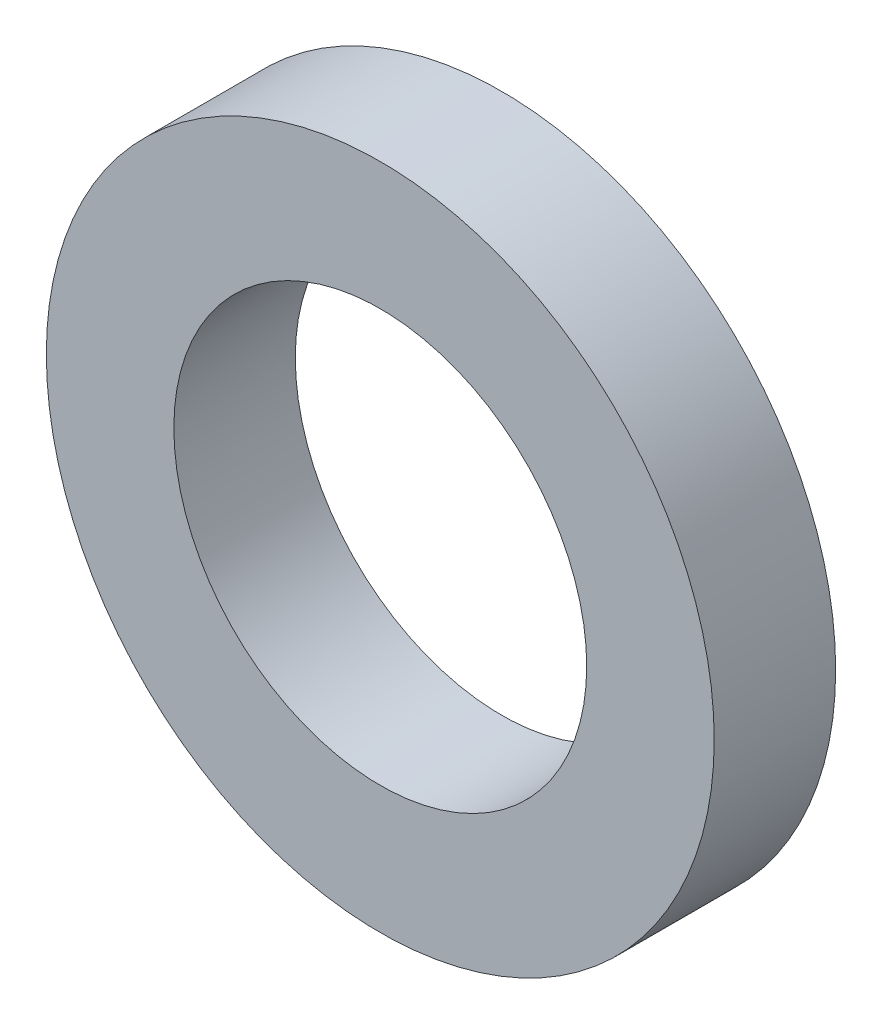
ISO-10303-21;
HEADER;
FILE_DESCRIPTION(('STEP AP214'),'2;1');
FILE_NAME('part.step','',(''),(''),'','','');
FILE_SCHEMA(('AUTOMOTIVE_DESIGN { 1 0 10303 214 1 1 1 1 }'));
ENDSEC;
DATA;
#1=APPLICATION_CONTEXT('core data for automotive mechanical design processes');
#2=APPLICATION_PROTOCOL_DEFINITION('international standard','automotive_design',2000,#1);
#3=PRODUCT_CONTEXT('',#1,'mechanical');
#4=PRODUCT('Part','Part','',(#3));
#5=PRODUCT_RELATED_PRODUCT_CATEGORY('part','',(#4));
#6=PRODUCT_DEFINITION_FORMATION('','',#4);
#7=PRODUCT_DEFINITION_CONTEXT('part definition',#1,'design');
#8=PRODUCT_DEFINITION('design','',#6,#7);
#9=PRODUCT_DEFINITION_SHAPE('','',#8);
#10=(LENGTH_UNIT() NAMED_UNIT(*) SI_UNIT(.MILLI.,.METRE.));
#11=(NAMED_UNIT(*) PLANE_ANGLE_UNIT() SI_UNIT($,.RADIAN.));
#12=(NAMED_UNIT(*) SI_UNIT($,.STERADIAN.) SOLID_ANGLE_UNIT());
#13=UNCERTAINTY_MEASURE_WITH_UNIT(LENGTH_MEASURE(1.E-05),#10,'distance_accuracy_value','');
#14=(GEOMETRIC_REPRESENTATION_CONTEXT(3) GLOBAL_UNCERTAINTY_ASSIGNED_CONTEXT((#13)) GLOBAL_UNIT_ASSIGNED_CONTEXT((#10,
#11,#12)) REPRESENTATION_CONTEXT('',''));
#15=CARTESIAN_POINT('',(0.,0.,0.));
#16=DIRECTION('',(0.,0.,1.));
#17=DIRECTION('',(1.,0.,0.));
#18=AXIS2_PLACEMENT_3D('',#15,#16,#17);
#19=CARTESIAN_POINT('',(0.,0.,1.));
#20=DIRECTION('',(0.,0.,1.));
#21=DIRECTION('',(1.,0.,0.));
#22=AXIS2_PLACEMENT_3D('',#19,#20,#21);
#23=PLANE('',#22);
#24=CARTESIAN_POINT('',(0.,0.,1.));
#25=DIRECTION('',(0.,0.,1.));
#26=DIRECTION('',(1.,0.,0.));
#27=AXIS2_PLACEMENT_3D('',#24,#25,#26);
#28=CIRCLE('',#27,2.75);
#29=CARTESIAN_POINT('',(2.75,0.,1.));
#30=VERTEX_POINT('',#29);
#31=EDGE_CURVE('E10',#30,#30,#28,.T.);
#32=ORIENTED_EDGE('',*,*,#31,.T.);
#33=EDGE_LOOP('',(#32));
#34=FACE_BOUND('',#33,.T.);
#35=CARTESIAN_POINT('',(0.,0.,1.));
#36=DIRECTION('',(0.,0.,1.));
#37=DIRECTION('',(1.,0.,0.));
#38=AXIS2_PLACEMENT_3D('',#35,#36,#37);
#39=CIRCLE('',#38,1.7);
#40=CARTESIAN_POINT('',(1.7,0.,1.));
#41=VERTEX_POINT('',#40);
#42=EDGE_CURVE('E56',#41,#41,#39,.T.);
#43=ORIENTED_EDGE('',*,*,#42,.F.);
#44=EDGE_LOOP('',(#43));
#45=FACE_BOUND('',#44,.T.);
#46=ADVANCED_FACE('F43',(#34,#45),#23,.T.);
#47=CARTESIAN_POINT('',(0.,0.,0.));
#48=DIRECTION('',(0.,0.,1.));
#49=DIRECTION('',(1.,0.,0.));
#50=AXIS2_PLACEMENT_3D('',#47,#48,#49);
#51=PLANE('',#50);
#52=CARTESIAN_POINT('',(0.,0.,0.));
#53=DIRECTION('',(0.,0.,1.));
#54=DIRECTION('',(1.,0.,0.));
#55=AXIS2_PLACEMENT_3D('',#52,#53,#54);
#56=CIRCLE('',#55,2.75);
#57=CARTESIAN_POINT('',(2.75,0.,0.));
#58=VERTEX_POINT('',#57);
#59=EDGE_CURVE('E47',#58,#58,#56,.T.);
#60=ORIENTED_EDGE('',*,*,#59,.F.);
#61=EDGE_LOOP('',(#60));
#62=FACE_BOUND('',#61,.T.);
#63=CARTESIAN_POINT('',(0.,0.,0.));
#64=DIRECTION('',(0.,0.,1.));
#65=DIRECTION('',(1.,0.,0.));
#66=AXIS2_PLACEMENT_3D('',#63,#64,#65);
#67=CIRCLE('',#66,1.7);
#68=CARTESIAN_POINT('',(1.7,0.,0.));
#69=VERTEX_POINT('',#68);
#70=EDGE_CURVE('E58',#69,#69,#67,.T.);
#71=ORIENTED_EDGE('',*,*,#70,.T.);
#72=EDGE_LOOP('',(#71));
#73=FACE_BOUND('',#72,.T.);
#74=ADVANCED_FACE('F70',(#62,#73),#51,.F.);
#75=CARTESIAN_POINT('',(0.,0.,1.));
#76=DIRECTION('',(0.,0.,-1.));
#77=DIRECTION('',(-1.,0.,0.));
#78=AXIS2_PLACEMENT_3D('',#75,#76,#77);
#79=CYLINDRICAL_SURFACE('',#78,2.75);
#80=ORIENTED_EDGE('',*,*,#31,.F.);
#81=EDGE_LOOP('',(#80));
#82=FACE_BOUND('',#81,.T.);
#83=ORIENTED_EDGE('',*,*,#59,.T.);
#84=EDGE_LOOP('',(#83));
#85=FACE_BOUND('',#84,.T.);
#86=ADVANCED_FACE('F45',(#82,#85),#79,.T.);
#87=CARTESIAN_POINT('',(0.,0.,1.));
#88=DIRECTION('',(0.,0.,-1.));
#89=DIRECTION('',(-1.,0.,0.));
#90=AXIS2_PLACEMENT_3D('',#87,#88,#89);
#91=CYLINDRICAL_SURFACE('',#90,1.7);
#92=ORIENTED_EDGE('',*,*,#42,.T.);
#93=EDGE_LOOP('',(#92));
#94=FACE_BOUND('',#93,.T.);
#95=ORIENTED_EDGE('',*,*,#70,.F.);
#96=EDGE_LOOP('',(#95));
#97=FACE_BOUND('',#96,.T.);
#98=ADVANCED_FACE('F66',(#94,#97),#91,.F.);
#99=CLOSED_SHELL('',(#46,#74,#86,#98));
#100=MANIFOLD_SOLID_BREP('B2',#99);
#101=ADVANCED_BREP_SHAPE_REPRESENTATION('',(#18,#100),#14);
#102=SHAPE_DEFINITION_REPRESENTATION(#9,#101);
ENDSEC;
END-ISO-10303-21;
